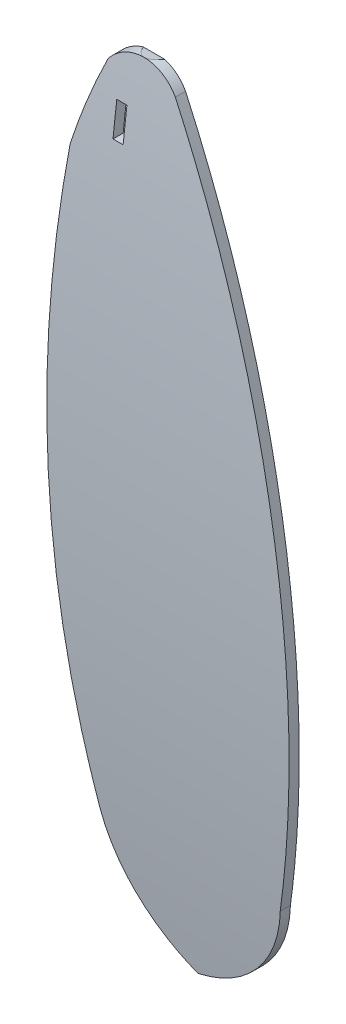
ISO-10303-21;
HEADER;
FILE_DESCRIPTION(('STEP AP214'),'2;1');
FILE_NAME('part.step','',(''),(''),'','','');
FILE_SCHEMA(('AUTOMOTIVE_DESIGN { 1 0 10303 214 1 1 1 1 }'));
ENDSEC;
DATA;
#1=APPLICATION_CONTEXT('core data for automotive mechanical design processes');
#2=APPLICATION_PROTOCOL_DEFINITION('international standard','automotive_design',2000,#1);
#3=PRODUCT_CONTEXT('',#1,'mechanical');
#4=PRODUCT('Part','Part','',(#3));
#5=PRODUCT_RELATED_PRODUCT_CATEGORY('part','',(#4));
#6=PRODUCT_DEFINITION_FORMATION('','',#4);
#7=PRODUCT_DEFINITION_CONTEXT('part definition',#1,'design');
#8=PRODUCT_DEFINITION('design','',#6,#7);
#9=PRODUCT_DEFINITION_SHAPE('','',#8);
#10=(LENGTH_UNIT() NAMED_UNIT(*) SI_UNIT(.MILLI.,.METRE.));
#11=(NAMED_UNIT(*) PLANE_ANGLE_UNIT() SI_UNIT($,.RADIAN.));
#12=(NAMED_UNIT(*) SI_UNIT($,.STERADIAN.) SOLID_ANGLE_UNIT());
#13=UNCERTAINTY_MEASURE_WITH_UNIT(LENGTH_MEASURE(1.E-05),#10,'distance_accuracy_value','');
#14=(GEOMETRIC_REPRESENTATION_CONTEXT(3) GLOBAL_UNCERTAINTY_ASSIGNED_CONTEXT((#13)) GLOBAL_UNIT_ASSIGNED_CONTEXT((#10,
#11,#12)) REPRESENTATION_CONTEXT('',''));
#15=CARTESIAN_POINT('',(0.,0.,0.));
#16=DIRECTION('',(0.,0.,1.));
#17=DIRECTION('',(1.,0.,0.));
#18=AXIS2_PLACEMENT_3D('',#15,#16,#17);
#19=CARTESIAN_POINT('',(-1.524,11.1196353242127,-50.8));
#20=DIRECTION('',(0.,-1.,0.));
#21=DIRECTION('',(0.,0.,-1.));
#22=AXIS2_PLACEMENT_3D('',#19,#20,#21);
#23=PLANE('',#22);
#24=DIRECTION('',(0.,0.,1.));
#25=VECTOR('',#24,1.);
#26=CARTESIAN_POINT('',(-1.524,11.1196353242127,-50.8));
#27=LINE('',#26,#25);
#28=CARTESIAN_POINT('',(-1.524,11.1196353242127,-0.0960141969770789));
#29=VERTEX_POINT('',#28);
#30=CARTESIAN_POINT('',(-1.524,11.1196353242127,1.43734487354896));
#31=VERTEX_POINT('',#30);
#32=EDGE_CURVE('E287',#29,#31,#27,.T.);
#33=ORIENTED_EDGE('',*,*,#32,.T.);
#34=DIRECTION('',(-1.,0.,0.));
#35=VECTOR('',#34,1.);
#36=CARTESIAN_POINT('',(50.8,11.1196353242127,1.43734487354896));
#37=LINE('',#36,#35);
#38=CARTESIAN_POINT('',(0.,11.1196353242127,1.43734487354896));
#39=VERTEX_POINT('',#38);
#40=EDGE_CURVE('E309',#31,#39,#37,.F.);
#41=ORIENTED_EDGE('',*,*,#40,.T.);
#42=DIRECTION('',(0.,0.,1.));
#43=VECTOR('',#42,1.);
#44=CARTESIAN_POINT('',(0.,11.1196353242127,-50.8));
#45=LINE('',#44,#43);
#46=CARTESIAN_POINT('',(0.,11.1196353242127,-0.0960141969770789));
#47=VERTEX_POINT('',#46);
#48=EDGE_CURVE('E279',#47,#39,#45,.T.);
#49=ORIENTED_EDGE('',*,*,#48,.F.);
#50=DIRECTION('',(-1.,0.,0.));
#51=VECTOR('',#50,1.);
#52=CARTESIAN_POINT('',(50.8,11.1196353242127,-0.0960141969770789));
#53=LINE('',#52,#51);
#54=EDGE_CURVE('E298',#47,#29,#53,.T.);
#55=ORIENTED_EDGE('',*,*,#54,.T.);
#56=EDGE_LOOP('',(#33,#41,#49,#55));
#57=FACE_BOUND('',#56,.T.);
#58=ADVANCED_FACE('F34',(#57),#23,.F.);
#59=CARTESIAN_POINT('',(0.,11.1196353242127,-50.8));
#60=DIRECTION('',(1.,0.,0.));
#61=DIRECTION('',(0.,0.,-1.));
#62=AXIS2_PLACEMENT_3D('',#59,#60,#61);
#63=PLANE('',#62);
#64=ORIENTED_EDGE('',*,*,#48,.T.);
#65=CARTESIAN_POINT('',(0.,-34.9373436465168,-414.275316504649));
#66=DIRECTION('',(1.,0.,0.));
#67=DIRECTION('',(0.,0.,-1.));
#68=AXIS2_PLACEMENT_3D('',#65,#66,#67);
#69=CIRCLE('',#68,418.256215903667);
#70=CARTESIAN_POINT('',(0.,15.990702378401,0.868750380737582));
#71=VERTEX_POINT('',#70);
#72=EDGE_CURVE('E281',#39,#71,#69,.F.);
#73=ORIENTED_EDGE('',*,*,#72,.T.);
#74=DIRECTION('',(0.,0.,1.));
#75=VECTOR('',#74,1.);
#76=CARTESIAN_POINT('',(0.,15.990702378401,-50.8));
#77=LINE('',#76,#75);
#78=CARTESIAN_POINT('',(0.,15.990702378401,-0.666716618157315));
#79=VERTEX_POINT('',#78);
#80=EDGE_CURVE('E286',#79,#71,#77,.T.);
#81=ORIENTED_EDGE('',*,*,#80,.F.);
#82=CARTESIAN_POINT('',(0.,-34.9373436465168,-414.275316504649));
#83=DIRECTION('',(1.,0.,0.));
#84=DIRECTION('',(0.,0.,-1.));
#85=AXIS2_PLACEMENT_3D('',#82,#83,#84);
#86=CIRCLE('',#85,416.732215903667);
#87=EDGE_CURVE('E283',#79,#47,#86,.T.);
#88=ORIENTED_EDGE('',*,*,#87,.T.);
#89=EDGE_LOOP('',(#64,#73,#81,#88));
#90=FACE_BOUND('',#89,.T.);
#91=ADVANCED_FACE('F267',(#90),#63,.F.);
#92=CARTESIAN_POINT('',(-1.524,15.990702378401,-50.8));
#93=DIRECTION('',(0.,1.,0.));
#94=DIRECTION('',(0.,0.,1.));
#95=AXIS2_PLACEMENT_3D('',#92,#93,#94);
#96=PLANE('',#95);
#97=ORIENTED_EDGE('',*,*,#80,.T.);
#98=DIRECTION('',(-1.,0.,0.));
#99=VECTOR('',#98,1.);
#100=CARTESIAN_POINT('',(50.8,15.990702378401,0.868750380737582));
#101=LINE('',#100,#99);
#102=CARTESIAN_POINT('',(-1.524,15.990702378401,0.868750380737582));
#103=VERTEX_POINT('',#102);
#104=EDGE_CURVE('E317',#71,#103,#101,.T.);
#105=ORIENTED_EDGE('',*,*,#104,.T.);
#106=DIRECTION('',(0.,0.,1.));
#107=VECTOR('',#106,1.);
#108=CARTESIAN_POINT('',(-1.524,15.990702378401,-50.8));
#109=LINE('',#108,#107);
#110=CARTESIAN_POINT('',(-1.524,15.990702378401,-0.666716618157315));
#111=VERTEX_POINT('',#110);
#112=EDGE_CURVE('E289',#111,#103,#109,.T.);
#113=ORIENTED_EDGE('',*,*,#112,.F.);
#114=DIRECTION('',(-1.,0.,0.));
#115=VECTOR('',#114,1.);
#116=CARTESIAN_POINT('',(50.8,15.990702378401,-0.666716618157315));
#117=LINE('',#116,#115);
#118=EDGE_CURVE('E152',#111,#79,#117,.F.);
#119=ORIENTED_EDGE('',*,*,#118,.T.);
#120=EDGE_LOOP('',(#97,#105,#113,#119));
#121=FACE_BOUND('',#120,.T.);
#122=ADVANCED_FACE('F236',(#121),#96,.F.);
#123=CARTESIAN_POINT('',(-1.524,11.1196353242127,-50.8));
#124=DIRECTION('',(-1.,0.,0.));
#125=DIRECTION('',(0.,0.,1.));
#126=AXIS2_PLACEMENT_3D('',#123,#124,#125);
#127=PLANE('',#126);
#128=ORIENTED_EDGE('',*,*,#112,.T.);
#129=CARTESIAN_POINT('',(-1.524,-34.9373436465168,-414.275316504649));
#130=DIRECTION('',(-1.,0.,0.));
#131=DIRECTION('',(0.,0.,1.));
#132=AXIS2_PLACEMENT_3D('',#129,#130,#131);
#133=CIRCLE('',#132,418.256215903667);
#134=EDGE_CURVE('E313',#103,#31,#133,.F.);
#135=ORIENTED_EDGE('',*,*,#134,.T.);
#136=ORIENTED_EDGE('',*,*,#32,.F.);
#137=CARTESIAN_POINT('',(-1.524,-34.9373436465168,-414.275316504649));
#138=DIRECTION('',(-1.,0.,0.));
#139=DIRECTION('',(0.,0.,1.));
#140=AXIS2_PLACEMENT_3D('',#137,#138,#139);
#141=CIRCLE('',#140,416.732215903667);
#142=EDGE_CURVE('E147',#29,#111,#141,.T.);
#143=ORIENTED_EDGE('',*,*,#142,.T.);
#144=EDGE_LOOP('',(#128,#135,#136,#143));
#145=FACE_BOUND('',#144,.T.);
#146=ADVANCED_FACE('F170',(#145),#127,.F.);
#147=CARTESIAN_POINT('',(50.8,-34.9373436465168,-414.275316504649));
#148=DIRECTION('',(-1.,0.,0.));
#149=DIRECTION('',(0.,0.,1.));
#150=AXIS2_PLACEMENT_3D('',#147,#148,#149);
#151=CYLINDRICAL_SURFACE('',#150,416.732215903667);
#152=CARTESIAN_POINT('',(9.37752582011459,-92.2968781916993,-1.50949479851487));
#153=CARTESIAN_POINT('',(9.08136566680049,-92.1476968419524,-1.48876429566343));
#154=CARTESIAN_POINT('',(8.7884390995515,-91.9922894079436,-1.46725038263321));
#155=CARTESIAN_POINT('',(8.2095097613994,-91.6692894970516,-1.42273660724434));
#156=CARTESIAN_POINT('',(7.92350678535656,-91.5016973817798,-1.399736788986));
#157=CARTESIAN_POINT('',(7.0767029281432,-90.9811297349922,-1.32864136435268));
#158=CARTESIAN_POINT('',(6.52693785093238,-90.6102775950368,-1.27843788382386));
#159=CARTESIAN_POINT('',(5.46132124949474,-89.8239895645493,-1.17320687535343));
#160=CARTESIAN_POINT('',(4.94544812161359,-89.4085825279978,-1.11818247364363));
#161=CARTESIAN_POINT('',(4.1995978333639,-88.7542965495554,-1.03262299138845));
#162=CARTESIAN_POINT('',(3.95563224015144,-88.5309962502855,-1.00359819140788));
#163=CARTESIAN_POINT('',(3.47732647673853,-88.0743110861633,-0.944631099464497));
#164=CARTESIAN_POINT('',(3.24298875209089,-87.8409236896255,-0.914688577724446));
#165=CARTESIAN_POINT('',(2.55498299209608,-87.1261719814676,-0.823630551352297));
#166=CARTESIAN_POINT('',(2.11640188249679,-86.6302879249371,-0.761293741642372));
#167=CARTESIAN_POINT('',(1.28272281862042,-85.6035030394792,-0.634231090506424));
#168=CARTESIAN_POINT('',(0.88762533787941,-85.0726018293162,-0.569505223073846));
#169=CARTESIAN_POINT('',(0.329812671482316,-84.2531117014952,-0.471292178593813));
#170=CARTESIAN_POINT('',(0.149714119917308,-83.9761511909546,-0.438373998669828));
#171=CARTESIAN_POINT('',(-0.198600301554659,-83.4149904576557,-0.372263469846666));
#172=CARTESIAN_POINT('',(-0.366819480845991,-83.1307922814416,-0.339071200205022));
#173=CARTESIAN_POINT('',(-0.853216899637336,-82.2680994030287,-0.239237952106478));
#174=CARTESIAN_POINT('',(-1.15326094586375,-81.6793212736923,-0.1723182951458));
#175=CARTESIAN_POINT('',(-1.77597417017566,-80.3184911241123,-0.020714174560132));
#176=CARTESIAN_POINT('',(-2.08339546724983,-79.5393822416651,0.0639560389427438));
#177=CARTESIAN_POINT('',(-2.48079756414862,-78.3502079595826,0.189666583879325));
#178=CARTESIAN_POINT('',(-2.60260743317367,-77.950561341744,0.231337958195669));
#179=CARTESIAN_POINT('',(-2.82481685076203,-77.1452071631659,0.314119003418244));
#180=CARTESIAN_POINT('',(-2.92521170854676,-76.7394982953234,0.355228549418847));
#181=CARTESIAN_POINT('',(-3.01475435418355,-76.3312811585591,0.395977063195237));
#182=B_SPLINE_CURVE_WITH_KNOTS('',3,(#152,#153,#154,#155,#156,#157,#158,#159,#160,#161,#162,
#163,#164,#165,#166,#167,#168,#169,#170,#171,#172,#173,#174,#175,#176,#177,#178,#179,#180,#181),
.UNSPECIFIED.,.F.,.F.,(4,2,2,2,2,2,2,2,2,2,2,2,2,2,4),(0.,0.996625052460673,1.99322053959339,
3.98584361794098,5.97718396708741,6.97292974911994,7.96892691397729,9.96123875462615,
11.9535722893755,12.9493301607263,13.9448095280834,15.9350956251333,18.455324145974,
19.7144355202253,20.9738224096919),.UNSPECIFIED.);
#183=CARTESIAN_POINT('',(9.37752582011426,-92.2968781916992,-1.50949479851481));
#184=VERTEX_POINT('',#183);
#185=CARTESIAN_POINT('',(-3.01475435418369,-76.3312811585591,0.395977063195219));
#186=VERTEX_POINT('',#185);
#187=EDGE_CURVE('E199',#184,#186,#182,.T.);
#188=ORIENTED_EDGE('',*,*,#187,.T.);
#189=CARTESIAN_POINT('',(-3.01475435418369,-76.3312811585591,0.395977063195219));
#190=CARTESIAN_POINT('',(-3.39224949869839,-74.610270276509,0.56777718575279));
#191=CARTESIAN_POINT('',(-3.75255930226903,-72.8845212428155,0.729222829900547));
#192=CARTESIAN_POINT('',(-4.43854411635565,-69.4243095964039,1.03108226570735));
#193=CARTESIAN_POINT('',(-4.76421887086309,-67.6898469193772,1.17149590190927));
#194=CARTESIAN_POINT('',(-5.68886382951516,-62.4746980792221,1.5606913660331));
#195=CARTESIAN_POINT('',(-6.23548240614732,-58.9821249892658,1.77744037525523));
#196=CARTESIAN_POINT('',(-7.18287167450204,-52.0049118982035,2.12176579844149));
#197=CARTESIAN_POINT('',(-7.58490332017147,-48.5204804195184,2.25012256944059));
#198=CARTESIAN_POINT('',(-8.24865632890356,-41.5361882169028,2.41929141785986));
#199=CARTESIAN_POINT('',(-8.51038067290296,-38.0363278223643,2.46010535525028));
#200=CARTESIAN_POINT('',(-8.89281267838532,-31.0289218317552,2.45330039095284));
#201=CARTESIAN_POINT('',(-9.01351753135393,-27.5213760840184,2.40567972806911));
#202=CARTESIAN_POINT('',(-9.11378214839692,-20.5065726039798,2.22174692351444));
#203=CARTESIAN_POINT('',(-9.09333946372025,-16.9993148777306,2.08543324315654));
#204=CARTESIAN_POINT('',(-8.91092635525993,-9.96124771258592,1.72283347616662));
#205=CARTESIAN_POINT('',(-8.74768073925645,-6.43051126659359,1.49574675832864));
#206=CARTESIAN_POINT('',(-8.39621246071908,-1.14696126542661,1.0884662686079));
#207=CARTESIAN_POINT('',(-8.26128436887329,0.612179504878576,0.941592575178425));
#208=CARTESIAN_POINT('',(-7.9560872621209,4.1254029128455,0.625819211881187));
#209=CARTESIAN_POINT('',(-7.78581842460892,5.87948557585184,0.456919652574919));
#210=CARTESIAN_POINT('',(-7.59797562750495,7.63062834687387,0.277101812202653));
#211=B_SPLINE_CURVE_WITH_KNOTS('',3,(#189,#190,#191,#192,#193,#194,#195,#196,#197,#198,#199,
#200,#201,#202,#203,#204,#205,#206,#207,#208,#209,#210),.UNSPECIFIED.,.F.,.F.,(4,2,2,2,2,2,2,2,
2,2,4),(0.,5.31059490298815,10.6212290570586,21.242108548868,31.7679779337965,42.2936236796566,
52.8194790484772,63.3455170295103,73.9665203972823,79.2773243488992,84.5881016433203),.UNSPECIFIED.);
#212=CARTESIAN_POINT('',(-7.59797562750489,7.63062834687388,0.277101812202751));
#213=VERTEX_POINT('',#212);
#214=EDGE_CURVE('E194',#186,#213,#211,.T.);
#215=ORIENTED_EDGE('',*,*,#214,.T.);
#216=CARTESIAN_POINT('',(-7.59797562750489,7.63062834687388,0.277101812202751));
#217=CARTESIAN_POINT('',(-7.32573778293458,8.70138708731263,0.167159589913933));
#218=CARTESIAN_POINT('',(-7.03245132185526,9.76641596215258,0.0535979523459558));
#219=CARTESIAN_POINT('',(-6.40485285923002,11.8817584277822,-0.180109581122475));
#220=CARTESIAN_POINT('',(-6.07060557231363,12.9320923828444,-0.300244929043531));
#221=CARTESIAN_POINT('',(-5.36130482529112,15.018137898575,-0.546791018195309));
#222=CARTESIAN_POINT('',(-4.98625145694589,16.0538494921188,-0.6732017453142));
#223=CARTESIAN_POINT('',(-4.19538092969777,18.1107199238172,-0.931972265404339));
#224=CARTESIAN_POINT('',(-3.77950099445815,19.1318534953406,-1.06434104497067));
#225=CARTESIAN_POINT('',(-3.34381680704609,20.1441097867132,-1.19932681308748));
#226=B_SPLINE_CURVE_WITH_KNOTS('',3,(#216,#217,#218,#219,#220,#221,#222,#223,#224,#225),
.UNSPECIFIED.,.F.,.F.,(4,2,2,2,4),(0.,3.33061549113126,6.65603513915092,9.98144730943297,
13.3120553162586),.UNSPECIFIED.);
#227=CARTESIAN_POINT('',(-3.3438168070461,20.1441097867132,-1.19932681308749));
#228=VERTEX_POINT('',#227);
#229=EDGE_CURVE('E189',#213,#228,#226,.T.);
#230=ORIENTED_EDGE('',*,*,#229,.T.);
#231=CARTESIAN_POINT('',(-3.3438168070461,20.1441097867132,-1.19932681308749));
#232=CARTESIAN_POINT('',(-3.23404371292992,20.2873015648351,-1.21842038612505));
#233=CARTESIAN_POINT('',(-3.11810453699733,20.4258413759666,-1.23696998949511));
#234=CARTESIAN_POINT('',(-2.87477841874723,20.6926486266148,-1.27282039652602));
#235=CARTESIAN_POINT('',(-2.74739147024114,20.8209160605784,-1.29012119951177));
#236=CARTESIAN_POINT('',(-2.48565042771361,21.06288550455,-1.3228632756649));
#237=CARTESIAN_POINT('',(-2.35157877963548,21.1768880816875,-1.33834224165939));
#238=CARTESIAN_POINT('',(-2.07435054124209,21.3934452813945,-1.3678281612888));
#239=CARTESIAN_POINT('',(-1.93119472385711,21.4960008758922,-1.38183523989123));
#240=CARTESIAN_POINT('',(-1.64321876232727,21.6847071197312,-1.40767207892789));
#241=CARTESIAN_POINT('',(-1.49874642863679,21.771379703613,-1.41957035268673));
#242=CARTESIAN_POINT('',(-1.2032823293786,21.9330251643901,-1.44180578584495));
#243=CARTESIAN_POINT('',(-1.05229059054919,22.0079980892638,-1.45214295164617));
#244=CARTESIAN_POINT('',(-0.740641462720208,22.1475734399677,-1.47141978543125));
#245=CARTESIAN_POINT('',(-0.579833771361957,22.2118466826951,-1.48031492783527));
#246=CARTESIAN_POINT('',(-0.253413228161956,22.3271013882421,-1.49628800861364));
#247=CARTESIAN_POINT('',(-0.0877997562823184,22.3780811273954,-1.50336571133274));
#248=CARTESIAN_POINT('',(0.0796617507557013,22.422190898666,-1.5094947985149));
#249=B_SPLINE_CURVE_WITH_KNOTS('',3,(#231,#232,#233,#234,#235,#236,#237,#238,#239,#240,#241,
#242,#243,#244,#245,#246,#247,#248),.UNSPECIFIED.,.F.,.F.,(4,2,2,2,2,2,2,2,4),(0.,
0.544145805114991,1.08829190439266,1.61768842589258,2.14703996371184,2.65319558001587,
3.15934912060061,3.67897621378686,4.19867064955794),.UNSPECIFIED.);
#250=CARTESIAN_POINT('',(0.0796617507551819,22.4221908986659,-1.50949479851487));
#251=VERTEX_POINT('',#250);
#252=EDGE_CURVE('E139',#228,#251,#249,.T.);
#253=ORIENTED_EDGE('',*,*,#252,.T.);
#254=DIRECTION('',(-1.,0.,0.));
#255=VECTOR('',#254,1.);
#256=CARTESIAN_POINT('',(50.8,22.4221908986659,-1.50949479851487));
#257=LINE('',#256,#255);
#258=CARTESIAN_POINT('',(3.31813864563008,22.4221908986659,-1.50949479851487));
#259=VERTEX_POINT('',#258);
#260=EDGE_CURVE('E126',#259,#251,#257,.T.);
#261=ORIENTED_EDGE('',*,*,#260,.F.);
#262=CARTESIAN_POINT('',(3.31813864562956,22.422190898666,-1.50949479851487));
#263=CARTESIAN_POINT('',(3.49286707943676,22.3761697788358,-1.50310020390491));
#264=CARTESIAN_POINT('',(3.66558272183455,22.3226660831876,-1.49567230012975));
#265=CARTESIAN_POINT('',(4.00573812146923,22.2012019972704,-1.47884088955136));
#266=CARTESIAN_POINT('',(4.17317833854789,22.1332428710597,-1.46943755549095));
#267=CARTESIAN_POINT('',(4.49713204725551,21.985390699276,-1.44902439147303));
#268=CARTESIAN_POINT('',(4.65381847719261,21.905869251613,-1.43806477023988));
#269=CARTESIAN_POINT('',(4.95996904386696,21.7341962560256,-1.41446361211398));
#270=CARTESIAN_POINT('',(5.10943362647949,21.6420454891837,-1.40182217923725));
#271=CARTESIAN_POINT('',(5.39474846058378,21.4494054529684,-1.37546982526557));
#272=CARTESIAN_POINT('',(5.53089784005667,21.349350950122,-1.36181579293468));
#273=CARTESIAN_POINT('',(5.79471812552231,21.138796885201,-1.33316858892903));
#274=CARTESIAN_POINT('',(5.92238891420901,21.0282971786624,-1.31817539873301));
#275=CARTESIAN_POINT('',(6.17174464362002,20.7944852221313,-1.28655480543517));
#276=CARTESIAN_POINT('',(6.29317839967536,20.6709094640091,-1.26989443475012));
#277=CARTESIAN_POINT('',(6.52550182169226,20.4143503769815,-1.23543157259096));
#278=CARTESIAN_POINT('',(6.63639091137455,20.2813665346042,-1.21762901878405));
#279=CARTESIAN_POINT('',(6.74161720343136,20.1441097867132,-1.19932681308744));
#280=B_SPLINE_CURVE_WITH_KNOTS('',3,(#262,#263,#264,#265,#266,#267,#268,#269,#270,#271,#272,
#273,#274,#275,#276,#277,#278,#279),.UNSPECIFIED.,.F.,.F.,(4,2,2,2,2,2,2,2,4),(0.,
0.542230714947677,1.08441403389407,1.6119639670316,2.13948128762199,2.64747742110776,
3.15548058153982,3.67706120244371,4.19867031202195),.UNSPECIFIED.);
#281=CARTESIAN_POINT('',(6.74161720343136,20.1441097867132,-1.19932681308749));
#282=VERTEX_POINT('',#281);
#283=EDGE_CURVE('E136',#259,#282,#280,.T.);
#284=ORIENTED_EDGE('',*,*,#283,.T.);
#285=CARTESIAN_POINT('',(6.74161720343137,20.1441097867132,-1.19932681308749));
#286=CARTESIAN_POINT('',(7.67870794959909,18.7022991429929,-1.00705553288555));
#287=CARTESIAN_POINT('',(8.58664299912147,17.2408447081191,-0.819874500793493));
#288=CARTESIAN_POINT('',(10.3426803361063,14.280979635833,-0.457099725832396));
#289=CARTESIAN_POINT('',(11.1907814210868,12.7825682565141,-0.281506215842126));
#290=CARTESIAN_POINT('',(12.8257260511702,9.75092964261044,0.0567066789284193));
#291=CARTESIAN_POINT('',(13.612559503521,8.21769672530438,0.219323926209268));
#292=CARTESIAN_POINT('',(15.1233614388731,5.11914957856606,0.530229827028914));
#293=CARTESIAN_POINT('',(15.847330349711,3.55383556755743,0.678518578083799));
#294=CARTESIAN_POINT('',(17.231557797926,0.392513227726858,0.959630389457136));
#295=CARTESIAN_POINT('',(17.8917683173781,-1.2035171660481,1.09244180876021));
#296=CARTESIAN_POINT('',(19.1465910246337,-4.42245411849586,1.34131828399159));
#297=CARTESIAN_POINT('',(19.7412030576358,-6.04536074058167,1.45738330040139));
#298=CARTESIAN_POINT('',(20.8636020085046,-9.3151096724213,1.67170524565343));
#299=CARTESIAN_POINT('',(21.3913953111587,-10.9619496784584,1.76996387635216));
#300=CARTESIAN_POINT('',(22.379167904422,-14.2768439504831,1.94774691022462));
#301=CARTESIAN_POINT('',(22.8391472671783,-15.9448981938989,2.02727133332965));
#302=CARTESIAN_POINT('',(23.6910882806882,-19.3021182711166,2.16688459870966));
#303=CARTESIAN_POINT('',(24.0829330296255,-20.9913151611552,2.22694018699412));
#304=CARTESIAN_POINT('',(24.7968525244297,-24.3849836223436,2.3267348278333));
#305=CARTESIAN_POINT('',(25.1189273919373,-26.0894551668574,2.36647391580915));
#306=CARTESIAN_POINT('',(25.6926998399861,-29.5107982962999,2.42507947061599));
#307=CARTESIAN_POINT('',(25.9443879116726,-31.2276715245177,2.443943118311));
#308=CARTESIAN_POINT('',(26.376835199388,-34.670416711297,2.46036911409942));
#309=CARTESIAN_POINT('',(26.5575949905707,-36.3962885967738,2.45793163492626));
#310=CARTESIAN_POINT('',(26.8476024695354,-39.8508081039884,2.43150608401919));
#311=CARTESIAN_POINT('',(26.9569753806769,-41.5794455041105,2.40755592514598));
#312=CARTESIAN_POINT('',(27.1045489266984,-45.0393116873594,2.33803403260947));
#313=CARTESIAN_POINT('',(27.142750017909,-46.7705404537999,2.29246243757811));
#314=CARTESIAN_POINT('',(27.147980758724,-50.2317717650171,2.17974400841313));
#315=CARTESIAN_POINT('',(27.1150360764187,-51.9617745268507,2.11260496285941));
#316=CARTESIAN_POINT('',(26.978195874397,-55.4178330113369,1.9569275567548));
#317=CARTESIAN_POINT('',(26.8743081095342,-57.1438891447099,1.86839153581034));
#318=CARTESIAN_POINT('',(26.6161973901908,-60.3381189293163,1.68467400139383));
#319=CARTESIAN_POINT('',(26.4715098109403,-61.8072361721294,1.59233867580241));
#320=CARTESIAN_POINT('',(26.1309284251713,-64.7381442498872,1.39259077046395));
#321=CARTESIAN_POINT('',(25.9350469830717,-66.1999367671451,1.28518183421452));
#322=CARTESIAN_POINT('',(25.492693269192,-69.1128863088282,1.05576019977551));
#323=CARTESIAN_POINT('',(25.2462818442462,-70.5640539707199,0.933765138790515));
#324=CARTESIAN_POINT('',(24.7031209320181,-73.4560044468644,0.675479845383127));
#325=CARTESIAN_POINT('',(24.4063599390312,-74.8967848088202,0.539186348255948));
#326=CARTESIAN_POINT('',(24.0846787136206,-76.3312811585593,0.395977063195183));
#327=B_SPLINE_CURVE_WITH_KNOTS('',3,(#285,#286,#287,#288,#289,#290,#291,#292,#293,#294,#295,
#296,#297,#298,#299,#300,#301,#302,#303,#304,#305,#306,#307,#308,#309,#310,#311,#312,#313,#314,
#315,#316,#317,#318,#319,#320,#321,#322,#323,#324,#325,#326),.UNSPECIFIED.,.F.,.F.,(4,2,2,2,2,2,
2,2,2,2,2,2,2,2,2,2,2,2,2,2,4),(0.,5.1905446001617,10.3811934848932,15.5726956355928,
20.7641624517653,25.959509080015,31.1548679681483,36.3497300444087,41.5445865938374,
46.7482700964795,51.9519445266467,57.1563216043324,62.3606564791277,67.5558374535211,
72.7509851179935,77.9442587816036,83.1369648545447,87.5733411840294,92.0086470218022,
96.4386430209994,100.869652714016),.UNSPECIFIED.);
#328=CARTESIAN_POINT('',(24.0846787136206,-76.3312811585593,0.395977063195219));
#329=VERTEX_POINT('',#328);
#330=EDGE_CURVE('E146',#282,#329,#327,.T.);
#331=ORIENTED_EDGE('',*,*,#330,.T.);
#332=CARTESIAN_POINT('',(24.0846787136206,-76.3312811585593,0.395977063195219));
#333=CARTESIAN_POINT('',(24.052862697816,-76.5977754051415,0.369375053314512));
#334=CARTESIAN_POINT('',(24.0154000820699,-76.8635461862261,0.34258497614255));
#335=CARTESIAN_POINT('',(23.929252523889,-77.3932205143547,0.288682301090143));
#336=CARTESIAN_POINT('',(23.8805679576779,-77.6571241236913,0.26156971405096));
#337=CARTESIAN_POINT('',(23.7178117234839,-78.4452956208079,0.179839896195566));
#338=CARTESIAN_POINT('',(23.5870211129764,-78.966161415195,0.124816897282306));
#339=CARTESIAN_POINT('',(23.2819171926531,-79.9945278806894,0.014264845051882));
#340=CARTESIAN_POINT('',(23.1076344682832,-80.5020376681945,-0.0412638263258226));
#341=CARTESIAN_POINT('',(22.8145433524623,-81.2507398679986,-0.124532029383769));
#342=CARTESIAN_POINT('',(22.7115634987603,-81.498223624306,-0.152285125051396));
#343=CARTESIAN_POINT('',(22.4951915451227,-81.9886786403464,-0.207722305792591));
#344=CARTESIAN_POINT('',(22.3817968153083,-82.2316487416041,-0.235406371612615));
#345=CARTESIAN_POINT('',(22.026261487931,-82.9531407372537,-0.31824481788235));
#346=CARTESIAN_POINT('',(21.7687732035808,-83.4242355098761,-0.373184465140745));
#347=CARTESIAN_POINT('',(21.2147968782532,-84.3429848013009,-0.481845639782866));
#348=CARTESIAN_POINT('',(20.9183080788264,-84.7906388640111,-0.535567143453326));
#349=CARTESIAN_POINT('',(20.2883425865906,-85.6594202055463,-0.641175970874163));
#350=CARTESIAN_POINT('',(19.9548632884301,-86.0805456125991,-0.693063165088787));
#351=CARTESIAN_POINT('',(19.2532715159155,-86.8931853256712,-0.794364105155273));
#352=CARTESIAN_POINT('',(18.8851601010045,-87.2847005368457,-0.843777926600133));
#353=CARTESIAN_POINT('',(18.1171838359462,-88.035004543566,-0.939471043055667));
#354=CARTESIAN_POINT('',(17.7173439110522,-88.3938185615651,-0.985752746654757));
#355=CARTESIAN_POINT('',(16.8884005188961,-89.0764838580723,-1.07462460714602));
#356=CARTESIAN_POINT('',(16.4592979407223,-89.4003361980507,-1.11721487610599));
#357=CARTESIAN_POINT('',(15.7962825598197,-89.8579022732422,-1.17787562163004));
#358=CARTESIAN_POINT('',(15.5721084318819,-90.0056891128474,-1.19755395223418));
#359=CARTESIAN_POINT('',(15.1176842003861,-90.2916304407626,-1.23577420709818));
#360=CARTESIAN_POINT('',(14.8874356120669,-90.4297873004775,-1.25431641099486));
#361=CARTESIAN_POINT('',(14.1882419972223,-90.8293857974921,-1.30813659594373));
#362=CARTESIAN_POINT('',(13.7106225349713,-91.076111704679,-1.34162894058385));
#363=CARTESIAN_POINT('',(12.7956624123688,-91.5005639722491,-1.3995698604258));
#364=CARTESIAN_POINT('',(12.3605461772203,-91.6830393732348,-1.42462360738119));
#365=CARTESIAN_POINT('',(11.4785708181138,-92.0148711428196,-1.47037116895621));
#366=CARTESIAN_POINT('',(11.0317351126938,-92.1642886549315,-1.49107302918119));
#367=CARTESIAN_POINT('',(10.5798056564902,-92.2968781916993,-1.50949479851487));
#368=B_SPLINE_CURVE_WITH_KNOTS('',3,(#332,#333,#334,#335,#336,#337,#338,#339,#340,#341,#342,
#343,#344,#345,#346,#347,#348,#349,#350,#351,#352,#353,#354,#355,#356,#357,#358,#359,#360,#361,
#362,#363,#364,#365,#366,#367),.UNSPECIFIED.,.F.,.F.,(4,2,2,2,2,2,2,2,2,2,2,2,2,2,2,2,2,4),(0.,
0.808985380204548,1.61794364255306,3.23544484246326,4.85181173870159,5.66006290059924,
6.46851871950581,8.08545881390663,9.70243035785998,11.3195158623632,12.936551914121,
14.5523299984318,16.1680590123469,16.9755236383389,17.7827887166377,19.3964933159059,
20.8127021522275,22.2262692697474),.UNSPECIFIED.);
#369=CARTESIAN_POINT('',(10.5798056564908,-92.2968781916992,-1.50949479851481));
#370=VERTEX_POINT('',#369);
#371=EDGE_CURVE('E149',#329,#370,#368,.T.);
#372=ORIENTED_EDGE('',*,*,#371,.T.);
#373=DIRECTION('',(-1.,0.,0.));
#374=VECTOR('',#373,1.);
#375=CARTESIAN_POINT('',(50.8,-92.2968781916992,-1.50949479851481));
#376=LINE('',#375,#374);
#377=EDGE_CURVE('E140',#370,#184,#376,.T.);
#378=ORIENTED_EDGE('',*,*,#377,.T.);
#379=EDGE_LOOP('',(#188,#215,#230,#253,#261,#284,#331,#372,#378));
#380=FACE_BOUND('',#379,.T.);
#381=ORIENTED_EDGE('',*,*,#54,.F.);
#382=ORIENTED_EDGE('',*,*,#87,.F.);
#383=ORIENTED_EDGE('',*,*,#118,.F.);
#384=ORIENTED_EDGE('',*,*,#142,.F.);
#385=EDGE_LOOP('',(#381,#382,#383,#384));
#386=FACE_BOUND('',#385,.T.);
#387=ADVANCED_FACE('F134',(#380,#386),#151,.F.);
#388=CARTESIAN_POINT('',(50.8,22.4221908986659,-1.50949479851487));
#389=DIRECTION('',(0.,-0.99048215125646,0.137641229442256));
#390=DIRECTION('',(0.,-0.137641229442256,-0.99048215125646));
#391=AXIS2_PLACEMENT_3D('',#388,#389,#390);
#392=PLANE('',#391);
#393=CARTESIAN_POINT('',(1.69890019819263,16.2773887994329,-45.7281989393907));
#394=DIRECTION('',(0.,-0.99048215125646,0.137641229442256));
#395=DIRECTION('',(0.,0.137641229442256,0.99048215125646));
#396=AXIS2_PLACEMENT_3D('',#393,#394,#395);
#397=ELLIPSE('',#396,46.1676153188454,6.354567332903);
#398=CARTESIAN_POINT('',(1.69890019819263,22.6319561323359,0.));
#399=VERTEX_POINT('',#398);
#400=EDGE_CURVE('E43',#399,#259,#397,.F.);
#401=ORIENTED_EDGE('',*,*,#400,.T.);
#402=ORIENTED_EDGE('',*,*,#260,.T.);
#403=EDGE_CURVE('E128',#251,#399,#397,.F.);
#404=ORIENTED_EDGE('',*,*,#403,.T.);
#405=EDGE_LOOP('',(#401,#402,#404));
#406=FACE_BOUND('',#405,.T.);
#407=ADVANCED_FACE('F125',(#406),#392,.F.);
#408=CARTESIAN_POINT('',(50.8,-92.2968781916993,-1.50949479851487));
#409=DIRECTION('',(0.,0.990482151256451,0.137641229442318));
#410=DIRECTION('',(0.,-0.137641229442318,0.990482151256451));
#411=AXIS2_PLACEMENT_3D('',#408,#409,#410);
#412=PLANE('',#411);
#413=CARTESIAN_POINT('',(5.2343233043722,-74.0807724959517,-132.594690928648));
#414=DIRECTION('',(0.,0.990482151256451,0.137641229442318));
#415=DIRECTION('',(0.,-0.137641229442318,0.990482151256451));
#416=AXIS2_PLACEMENT_3D('',#413,#414,#415);
#417=ELLIPSE('',#416,137.925403348648,18.9842220882356);
#418=CARTESIAN_POINT('',(9.80465904563834,-92.5066434253694,0.));
#419=VERTEX_POINT('',#418);
#420=EDGE_CURVE('E49',#370,#419,#417,.F.);
#421=ORIENTED_EDGE('',*,*,#420,.T.);
#422=CARTESIAN_POINT('',(19.957926377032,-71.2923560536931,-152.660457033161));
#423=DIRECTION('',(0.,0.990482151256451,0.137641229442318));
#424=DIRECTION('',(0.,-0.137641229442318,0.990482151256451));
#425=AXIS2_PLACEMENT_3D('',#422,#423,#424);
#426=ELLIPSE('',#425,170.870448117957,23.5188185543154);
#427=EDGE_CURVE('E12',#419,#184,#426,.F.);
#428=ORIENTED_EDGE('',*,*,#427,.T.);
#429=ORIENTED_EDGE('',*,*,#377,.F.);
#430=EDGE_LOOP('',(#421,#428,#429));
#431=FACE_BOUND('',#430,.T.);
#432=ADVANCED_FACE('F171',(#431),#412,.F.);
#433=CARTESIAN_POINT('',(50.8,-34.9373436465168,-414.275316504649));
#434=DIRECTION('',(-1.,0.,0.));
#435=DIRECTION('',(0.,0.,1.));
#436=AXIS2_PLACEMENT_3D('',#433,#434,#435);
#437=CYLINDRICAL_SURFACE('',#436,418.256215903667);
#438=CARTESIAN_POINT('',(24.0846787136206,-76.3312811585593,1.9275235617105));
#439=CARTESIAN_POINT('',(24.4571673721079,-74.6702580069424,2.0927458552644));
#440=CARTESIAN_POINT('',(24.7962307329193,-73.0008069884728,2.24871878349487));
#441=CARTESIAN_POINT('',(25.4068236501572,-69.6479105587089,2.54150829306814));
#442=CARTESIAN_POINT('',(25.678352241987,-67.9644649478853,2.6783246007854));
#443=CARTESIAN_POINT('',(26.1531918484304,-64.5864163234846,2.93214390298034));
#444=CARTESIAN_POINT('',(26.3564999560508,-62.8918128375876,3.04914605303717));
#445=CARTESIAN_POINT('',(26.6943643851575,-59.4944984566659,3.26283113947378));
#446=CARTESIAN_POINT('',(26.8289211301013,-57.7917876116417,3.35951420100195));
#447=CARTESIAN_POINT('',(27.028819441548,-54.382680810308,3.53211715422949));
#448=CARTESIAN_POINT('',(27.0942184826701,-52.6762890968483,3.60805424820663));
#449=CARTESIAN_POINT('',(27.1557708930281,-49.2614470965352,3.73903941928896));
#450=CARTESIAN_POINT('',(27.1519239538342,-47.5529968005466,3.79408740335042));
#451=CARTESIAN_POINT('',(27.0749109285644,-44.1372330586864,3.88319748460612));
#452=CARTESIAN_POINT('',(27.0017497917603,-42.4299195403551,3.91726107987119));
#453=CARTESIAN_POINT('',(26.7861963559838,-39.0193803495294,3.96445638004286));
#454=CARTESIAN_POINT('',(26.6438041241493,-37.3161546730723,3.9775881052484));
#455=CARTESIAN_POINT('',(26.2898562300435,-33.9152304244974,3.98311051338176));
#456=CARTESIAN_POINT('',(26.0782347598319,-32.2175386697169,3.97548141078096));
#457=CARTESIAN_POINT('',(25.5862561640135,-28.8323603109209,3.93976753773267));
#458=CARTESIAN_POINT('',(25.3058989522023,-27.144873719707,3.91168274163073));
#459=CARTESIAN_POINT('',(24.6769529667642,-23.7829178941008,3.83551619196406));
#460=CARTESIAN_POINT('',(24.3283562466121,-22.1084501993998,3.78743210873809));
#461=CARTESIAN_POINT('',(23.5636386988482,-18.7756965604894,3.67186133488234));
#462=CARTESIAN_POINT('',(23.1475183342124,-17.1174105054131,3.60437477728321));
#463=CARTESIAN_POINT('',(22.2490385611547,-13.8216108070336,3.45079789318171));
#464=CARTESIAN_POINT('',(21.7667483957258,-12.18407737873,3.364726960864));
#465=CARTESIAN_POINT('',(20.7365449623353,-8.93084044227077,3.17477495495681));
#466=CARTESIAN_POINT('',(20.1886318987333,-7.31513686615104,3.07089393683021));
#467=CARTESIAN_POINT('',(19.0284259842159,-4.10878841303495,2.8463016659801));
#468=CARTESIAN_POINT('',(18.4161535743545,-2.51813576310829,2.72559575303327));
#469=CARTESIAN_POINT('',(17.1283065874886,0.635861545475959,2.46838461302907));
#470=CARTESIAN_POINT('',(16.452738057358,2.19920879580776,2.33188089489238));
#471=CARTESIAN_POINT('',(15.0969156912644,5.17041115054049,2.05588807479315));
#472=CARTESIAN_POINT('',(14.421498485572,6.58058277835073,1.91754182467402));
#473=CARTESIAN_POINT('',(13.0194543387232,9.37363980118011,1.62944371710291));
#474=CARTESIAN_POINT('',(12.2928393166255,10.7565314517619,1.4796945136537));
#475=CARTESIAN_POINT('',(10.7905984161717,13.4912596347712,1.1700139342979));
#476=CARTESIAN_POINT('',(10.0150554744181,14.8431436898414,1.01009978545864));
#477=CARTESIAN_POINT('',(8.41485674596537,17.5167591088014,0.680880928597562));
#478=CARTESIAN_POINT('',(7.59019038124425,18.8384838929619,0.511574198561573));
#479=CARTESIAN_POINT('',(6.74161720343139,20.1441097867132,0.338112643198826));
#480=B_SPLINE_CURVE_WITH_KNOTS('',3,(#438,#439,#440,#441,#442,#443,#444,#445,#446,#447,#448,
#449,#450,#451,#452,#453,#454,#455,#456,#457,#458,#459,#460,#461,#462,#463,#464,#465,#466,#467,
#468,#469,#470,#471,#472,#473,#474,#475,#476,#477,#478,#479),.UNSPECIFIED.,.F.,.F.,(4,2,2,2,2,2,
2,2,2,2,2,2,2,2,2,2,2,2,2,2,4),(0.,5.13047441177186,10.261022097722,15.3917883774587,
20.5225230550894,25.6489903942236,30.7754805672712,35.9016047189056,41.0277238994117,
46.1587300954679,51.2897427265724,56.4213532225147,61.552928535045,66.6791743267263,
71.8054041549155,76.9300107420975,82.0541282579947,86.7620839977566,91.4689473048039,
96.1680360034258,100.868140266959),.UNSPECIFIED.);
#481=CARTESIAN_POINT('',(24.0846787136206,-76.3312811585593,1.9275235617105));
#482=VERTEX_POINT('',#481);
#483=CARTESIAN_POINT('',(6.74161720343136,20.1441097867132,0.338112643198829));
#484=VERTEX_POINT('',#483);
#485=EDGE_CURVE('E252',#482,#484,#480,.T.);
#486=ORIENTED_EDGE('',*,*,#485,.T.);
#487=CARTESIAN_POINT('',(6.74161720343136,20.1441097867132,0.338112643198829));
#488=CARTESIAN_POINT('',(6.63331018936872,20.2853871471725,0.319344187391411));
#489=CARTESIAN_POINT('',(6.51900399680666,20.4221348669164,0.301103478205807));
#490=CARTESIAN_POINT('',(6.27923771329482,20.6856426186122,0.265831219226633));
#491=CARTESIAN_POINT('',(6.15377764690637,20.8124026725563,0.248799666770594));
#492=CARTESIAN_POINT('',(5.89259336002192,21.0549648099187,0.216105032816617));
#493=CARTESIAN_POINT('',(5.75687275169408,21.170770717661,0.200441473870787));
#494=CARTESIAN_POINT('',(5.47607603838614,21.3906323664827,0.17061913385791));
#495=CARTESIAN_POINT('',(5.33100015925764,21.4946883910569,0.156460316485766));
#496=CARTESIAN_POINT('',(5.03242419625618,21.6903378795522,0.129772249785029));
#497=CARTESIAN_POINT('',(4.87891980048966,21.7819248795701,0.11724384580497));
#498=CARTESIAN_POINT('',(4.56457927621809,21.9519238535315,0.0939400200615454));
#499=CARTESIAN_POINT('',(4.40374045659984,22.0303309413019,0.0831652484670398));
#500=CARTESIAN_POINT('',(4.07604150439562,22.1732906923171,0.0634854369908339));
#501=CARTESIAN_POINT('',(3.90918562309499,22.237852921825,0.054579106181571));
#502=CARTESIAN_POINT('',(3.57047872359049,22.3527250512908,0.0387111807544473));
#503=CARTESIAN_POINT('',(3.39862590080964,22.4030297300382,0.0317502985858411));
#504=CARTESIAN_POINT('',(3.05232665809525,22.4886991580719,0.0198845415385673));
#505=CARTESIAN_POINT('',(2.87790364397196,22.5241567682577,0.0149668888378301));
#506=CARTESIAN_POINT('',(2.52665039191769,22.5803237666909,0.00717272585709011));
#507=CARTESIAN_POINT('',(2.34982011496309,22.6010329155635,0.00429624870640508));
#508=CARTESIAN_POINT('',(1.99500226792613,22.6275465324389,0.000612968255051608));
#509=CARTESIAN_POINT('',(1.81701455771973,22.6333491607984,-0.000193579591491075));
#510=CARTESIAN_POINT('',(1.46118272935201,22.6300003110134,0.000271787269712165));
#511=CARTESIAN_POINT('',(1.28333861088845,22.6208488644269,0.00154369759124774));
#512=CARTESIAN_POINT('',(0.929969718474577,22.5877456805028,0.00614158437237948));
#513=CARTESIAN_POINT('',(0.754437760106233,22.5638691239045,0.00945712678681439));
#514=CARTESIAN_POINT('',(0.406030383432444,22.5015618689284,0.0181003665719648));
#515=CARTESIAN_POINT('',(0.233154911059463,22.4631314671748,0.0234280229334674));
#516=CARTESIAN_POINT('',(-0.10876980011885,22.3719904397839,0.0360452551313587));
#517=CARTESIAN_POINT('',(-0.27781791534189,22.3192756781627,0.0433353991948382));
#518=CARTESIAN_POINT('',(-0.610785832535476,22.1999845033119,0.0598032895691894));
#519=CARTESIAN_POINT('',(-0.774707461367343,22.1334130942638,0.0689803544240708));
#520=CARTESIAN_POINT('',(-1.09673225560133,21.9867098417015,0.0891604579911479));
#521=CARTESIAN_POINT('',(-1.25482029247558,21.9065453959697,0.100167885478774));
#522=CARTESIAN_POINT('',(-1.56359822711277,21.7333901334901,0.123884392902616));
#523=CARTESIAN_POINT('',(-1.7142907807765,21.6404039677241,0.136592855752398));
#524=CARTESIAN_POINT('',(-2.00721426456581,21.4423171146121,0.163588493329336));
#525=CARTESIAN_POINT('',(-2.1494499379394,21.3372233171818,0.17787477000309));
#526=CARTESIAN_POINT('',(-2.42453220325426,21.1156746653732,0.207896388339869));
#527=CARTESIAN_POINT('',(-2.55738221051312,20.9992239807154,0.223631198050929));
#528=CARTESIAN_POINT('',(-2.80435497255398,20.7638511743973,0.255324307111935));
#529=CARTESIAN_POINT('',(-2.91913549660481,20.6456067493052,0.271198371099979));
#530=CARTESIAN_POINT('',(-3.1389030335269,20.4008852868546,0.303937453629919));
#531=CARTESIAN_POINT('',(-3.24390845052956,20.2744245140372,0.320800508353288));
#532=CARTESIAN_POINT('',(-3.34381680704609,20.1441097867132,0.338112643198859));
#533=B_SPLINE_CURVE_WITH_KNOTS('',3,(#487,#488,#489,#490,#491,#492,#493,#494,#495,#496,#497,
#498,#499,#500,#501,#502,#503,#504,#505,#506,#507,#508,#509,#510,#511,#512,#513,#514,#515,#516,
#517,#518,#519,#520,#521,#522,#523,#524,#525,#526,#527,#528,#529,#530,#531,#532),.UNSPECIFIED.,
.F.,.F.,(4,2,2,2,2,2,2,2,2,2,2,2,2,2,2,2,2,2,2,2,2,2,4),(0.,0.536850874178348,1.07370056621563,
1.61036213551222,2.14701075376355,2.68393651821077,3.22106089958048,3.75781294427306,
4.29476129792911,4.8282992501624,5.36184586179003,5.89545831630913,6.42906964473702,
6.9599788590473,7.49087725339669,8.02192953198571,8.55279035838645,9.0849429195477,
9.61690295173651,10.1485617505474,10.6800260786415,11.176196234955,11.671412486334),.UNSPECIFIED.);
#534=EDGE_CURVE('E318',#484,#399,#533,.T.);
#535=ORIENTED_EDGE('',*,*,#534,.T.);
#536=CARTESIAN_POINT('',(-3.3438168070461,20.1441097867132,0.338112643198829));
#537=VERTEX_POINT('',#536);
#538=EDGE_CURVE('E57',#399,#537,#533,.T.);
#539=ORIENTED_EDGE('',*,*,#538,.T.);
#540=CARTESIAN_POINT('',(-3.34381680704608,20.1441097867132,0.338112643198829));
#541=CARTESIAN_POINT('',(-3.77950499329501,19.1318442197559,0.472599100358718));
#542=CARTESIAN_POINT('',(-4.19538759182516,18.110703440986,0.604478414809713));
#543=CARTESIAN_POINT('',(-4.98626129839558,16.0538230545748,0.862292350942475));
#544=CARTESIAN_POINT('',(-5.36131518210505,15.0181087048233,0.988235924989236));
#545=CARTESIAN_POINT('',(-6.07061525153956,12.932062650807,1.23387110873239));
#546=CARTESIAN_POINT('',(-6.40486134616805,11.8817309139171,1.35356270447195));
#547=CARTESIAN_POINT('',(-7.03245627126307,9.76639818619544,1.58640715284835));
#548=CARTESIAN_POINT('',(-7.32574038956306,8.70137684052622,1.6995494974457));
#549=CARTESIAN_POINT('',(-7.59797562750489,7.63062834687388,1.80908587355167));
#550=B_SPLINE_CURVE_WITH_KNOTS('',3,(#540,#541,#542,#543,#544,#545,#546,#547,#548,#549),
.UNSPECIFIED.,.F.,.F.,(4,2,2,2,4),(0.,3.3304562531381,6.65571724384527,9.98098565750605,
13.3114493401122),.UNSPECIFIED.);
#551=CARTESIAN_POINT('',(-7.59797562750489,7.63062834687388,1.80908587355166));
#552=VERTEX_POINT('',#551);
#553=EDGE_CURVE('E222',#537,#552,#550,.T.);
#554=ORIENTED_EDGE('',*,*,#553,.T.);
#555=CARTESIAN_POINT('',(-7.59797562750492,7.63062834687386,1.80908587355166));
#556=CARTESIAN_POINT('',(-7.78582153424074,5.87945646233871,1.98824462160906));
#557=CARTESIAN_POINT('',(-7.95609206647204,4.1253526203511,2.15652496007948));
#558=CARTESIAN_POINT('',(-8.26129073129425,0.612101252639633,2.47114045109707));
#559=CARTESIAN_POINT('',(-8.39621868772639,-1.14704629817951,2.61747549426028));
#560=CARTESIAN_POINT('',(-8.74768533474759,-6.43059749711198,3.02326221732462));
#561=CARTESIAN_POINT('',(-8.91092822282007,-9.96130915735145,3.24951592132934));
#562=CARTESIAN_POINT('',(-9.0933402850855,-16.9993570871533,3.6107896679909));
#563=CARTESIAN_POINT('',(-9.11378206875632,-20.5066208098936,3.74660579723098));
#564=CARTESIAN_POINT('',(-9.01351629971367,-27.5214196214357,3.92986706193385));
#565=CARTESIAN_POINT('',(-8.89281117987367,-31.0289547045182,3.97731372053727));
#566=CARTESIAN_POINT('',(-8.51037974932077,-38.0363393303453,3.9840935007726));
#567=CARTESIAN_POINT('',(-8.24865622668448,-41.5361890236642,3.94342836441588));
#568=CARTESIAN_POINT('',(-7.58490387672613,-48.5204748320654,3.77487646284031));
#569=CARTESIAN_POINT('',(-7.18287208818997,-52.0049106202645,3.6469878567107));
#570=CARTESIAN_POINT('',(-6.23548573494909,-58.9820986892278,3.30392102350834));
#571=CARTESIAN_POINT('',(-5.68887274588724,-62.4746431455643,3.08796687187752));
#572=CARTESIAN_POINT('',(-4.76423040366907,-67.6897841951165,2.70019870471418));
#573=CARTESIAN_POINT('',(-4.43855553572356,-69.424250248215,2.56030000294092));
#574=CARTESIAN_POINT('',(-3.75256751052435,-72.8844815861495,2.25954748224106));
#575=CARTESIAN_POINT('',(-3.39225460748988,-74.6102469347449,2.09869381710634));
#576=CARTESIAN_POINT('',(-3.0147543541836,-76.3312811585591,1.92752356171055));
#577=B_SPLINE_CURVE_WITH_KNOTS('',3,(#555,#556,#557,#558,#559,#560,#561,#562,#563,#564,#565,
#566,#567,#568,#569,#570,#571,#572,#573,#574,#575,#576),.UNSPECIFIED.,.F.,.F.,(4,2,2,2,2,2,2,2,
2,2,4),(0.,5.3106647005722,10.6213558707042,21.2421338767537,31.7681398880757,42.2939644709507,
52.8195809552514,63.3454195967336,73.9660746278034,79.2765972416,84.5870808828073),.UNSPECIFIED.);
#578=CARTESIAN_POINT('',(-3.01475435418369,-76.3312811585591,1.9275235617105));
#579=VERTEX_POINT('',#578);
#580=EDGE_CURVE('E215',#552,#579,#577,.T.);
#581=ORIENTED_EDGE('',*,*,#580,.T.);
#582=CARTESIAN_POINT('',(-3.01475435418356,-76.3312811585591,1.9275235617105));
#583=CARTESIAN_POINT('',(-2.94356414152848,-76.6558417358147,1.89524454661783));
#584=CARTESIAN_POINT('',(-2.86550725283046,-76.978835023901,1.86273683632263));
#585=CARTESIAN_POINT('',(-2.69579645181821,-77.621181706851,1.79734092412894));
#586=CARTESIAN_POINT('',(-2.60414288395935,-77.9405351937041,1.76445273188897));
#587=CARTESIAN_POINT('',(-2.30903355506798,-78.8922482748526,1.66534637014789));
#588=CARTESIAN_POINT('',(-2.0853944157558,-79.5184188106844,1.59867064390469));
#589=CARTESIAN_POINT('',(-1.58602103965836,-80.7493177792618,1.46487684579164));
#590=CARTESIAN_POINT('',(-1.31030541072515,-81.3540537795599,1.39775894016254));
#591=CARTESIAN_POINT('',(-0.859200661297182,-82.2418913211876,1.29733752958501));
#592=CARTESIAN_POINT('',(-0.7025714008484,-82.5346354423795,1.26390520073041));
#593=CARTESIAN_POINT('',(-0.377014268404537,-83.1133230377683,1.19721206450223));
#594=CARTESIAN_POINT('',(-0.208083255180473,-83.3992647500798,1.16395130327626));
#595=CARTESIAN_POINT('',(0.316877663637308,-84.2463278464974,1.06455560715749));
#596=CARTESIAN_POINT('',(0.690953266971523,-84.7964467660334,0.998834525384524));
#597=CARTESIAN_POINT('',(1.48448480091795,-85.8631723595227,0.869370211531243));
#598=CARTESIAN_POINT('',(1.90394098932194,-86.3797788430766,0.805626990689139));
#599=CARTESIAN_POINT('',(2.56469054825628,-87.1265163269261,0.712171686998651));
#600=CARTESIAN_POINT('',(2.79014245389106,-87.3706773356677,0.681387084814944));
#601=CARTESIAN_POINT('',(3.25116686672102,-87.8492092301913,0.620640056106819));
#602=CARTESIAN_POINT('',(3.48673644875893,-88.0835829074861,0.590677395998722));
#603=CARTESIAN_POINT('',(4.20808951047142,-88.7714482158102,0.502172020430263));
#604=CARTESIAN_POINT('',(4.70865558804575,-89.209840384647,0.444992288632453));
#605=CARTESIAN_POINT('',(5.57890450474256,-89.9090867300169,0.352771158218294));
#606=CARTESIAN_POINT('',(5.93906069247526,-90.1817793164543,0.316512254954194));
#607=CARTESIAN_POINT('',(6.67462305390775,-90.7060772082699,0.246311884626149));
#608=CARTESIAN_POINT('',(7.0500277786338,-90.9576845103244,0.212370198189328));
#609=CARTESIAN_POINT('',(7.81461472932146,-91.4387867905124,0.147062295293827));
#610=CARTESIAN_POINT('',(8.2037879317414,-91.668295897202,0.115694435172652));
#611=CARTESIAN_POINT('',(8.99494960787174,-92.1046667336591,0.0557197119837584));
#612=CARTESIAN_POINT('',(9.39694091524802,-92.3115234102617,0.0271134651276195));
#613=CARTESIAN_POINT('',(9.80465904563833,-92.5066434253694,0.));
#614=B_SPLINE_CURVE_WITH_KNOTS('',3,(#582,#583,#584,#585,#586,#587,#588,#589,#590,#591,#592,
#593,#594,#595,#596,#597,#598,#599,#600,#601,#602,#603,#604,#605,#606,#607,#608,#609,#610,#611,
#612,#613),.UNSPECIFIED.,.F.,.F.,(4,2,2,2,2,2,2,2,2,2,2,2,2,2,2,4),(0.,1.00137311252973,
2.00272086081749,4.00492937693689,6.00642381731309,7.00723714875999,8.00830693818794,
10.0112570682855,12.0142185770638,13.0152112211322,14.0159163875002,16.0166999368205,
17.3756382459217,18.7344477242701,20.0923825926688,21.4506197664045),.UNSPECIFIED.);
#615=EDGE_CURVE('E221',#579,#419,#614,.T.);
#616=ORIENTED_EDGE('',*,*,#615,.T.);
#617=CARTESIAN_POINT('',(9.80465904563831,-92.5066434253694,0.));
#618=CARTESIAN_POINT('',(10.0633610190167,-92.4424756798851,0.00891667747004404));
#619=CARTESIAN_POINT('',(10.3206577330512,-92.3728713738539,0.0185743178969641));
#620=CARTESIAN_POINT('',(10.8320330804588,-92.2229151033884,0.0393359368626902));
#621=CARTESIAN_POINT('',(11.0861118034719,-92.1425634390555,0.0504398750159148));
#622=CARTESIAN_POINT('',(11.8427790225018,-91.8856214470655,0.0858614418311629));
#623=CARTESIAN_POINT('',(12.3399551457586,-91.6931052521026,0.112294245840527));
#624=CARTESIAN_POINT('',(13.3155916889443,-91.2673020056686,0.170390432106295));
#625=CARTESIAN_POINT('',(13.7940710127297,-91.0340575111914,0.202048352765751));
#626=CARTESIAN_POINT('',(14.495519772794,-90.6548977049171,0.253129480131182));
#627=CARTESIAN_POINT('',(14.7266349230419,-90.5236219876226,0.270756487155046));
#628=CARTESIAN_POINT('',(15.1831424971257,-90.2514966502561,0.307154756940922));
#629=CARTESIAN_POINT('',(15.4085334839538,-90.1106446581358,0.325926303086179));
#630=CARTESIAN_POINT('',(16.0754402157762,-89.6741388736011,0.383858688982295));
#631=CARTESIAN_POINT('',(16.5077713752773,-89.3644911228365,0.42464324415504));
#632=CARTESIAN_POINT('',(17.3446760957479,-88.7102718574511,0.50998111374657));
#633=CARTESIAN_POINT('',(17.7492488902517,-88.3656993791366,0.554534532155668));
#634=CARTESIAN_POINT('',(18.5279346937873,-87.6440443404086,0.646842619146054));
#635=CARTESIAN_POINT('',(18.902046518317,-87.2669605169351,0.694597412084122));
#636=CARTESIAN_POINT('',(19.6172122577575,-86.4829785281289,0.792708857104725));
#637=CARTESIAN_POINT('',(19.9582667211849,-86.0760808576902,0.843065465994403));
#638=CARTESIAN_POINT('',(20.6071045782616,-85.2326006404547,0.946107505002261));
#639=CARTESIAN_POINT('',(20.9146570075403,-84.7958421439401,0.998805957891722));
#640=CARTESIAN_POINT('',(21.4918346563318,-83.8980384778681,1.10561314414897));
#641=CARTESIAN_POINT('',(21.7614603881456,-83.4369936364781,1.15972185845572));
#642=CARTESIAN_POINT('',(22.1359506551236,-82.729869598231,1.24146174208945));
#643=CARTESIAN_POINT('',(22.2557871087585,-82.4915740620407,1.26880391329269));
#644=CARTESIAN_POINT('',(22.4852840838784,-82.0102177558695,1.32360711824449));
#645=CARTESIAN_POINT('',(22.5949472497123,-81.7671582442009,1.35106811915218));
#646=CARTESIAN_POINT('',(22.908377070654,-81.0314989111759,1.43351710799335));
#647=CARTESIAN_POINT('',(23.096677462632,-80.532241829381,1.48859151617758));
#648=CARTESIAN_POINT('',(23.461659506958,-79.4253518940345,1.60861402297925));
#649=CARTESIAN_POINT('',(23.6296741552348,-78.8148253772194,1.67349438102336));
#650=CARTESIAN_POINT('',(23.8352501091714,-77.8894454190411,1.7697235518408));
#651=CARTESIAN_POINT('',(23.8960061871583,-77.5796233140329,1.80159452339738));
#652=CARTESIAN_POINT('',(24.0020046726262,-76.957299701699,1.86490423680263));
#653=CARTESIAN_POINT('',(24.0472474141529,-76.6447982522156,1.89634298794422));
#654=CARTESIAN_POINT('',(24.0846787136206,-76.3312811585592,1.92752356171048));
#655=B_SPLINE_CURVE_WITH_KNOTS('',3,(#617,#618,#619,#620,#621,#622,#623,#624,#625,#626,#627,
#628,#629,#630,#631,#632,#633,#634,#635,#636,#637,#638,#639,#640,#641,#642,#643,#644,#645,#646,
#647,#648,#649,#650,#651,#652,#653,#654),.UNSPECIFIED.,.F.,.F.,(4,2,2,2,2,2,2,2,2,2,2,2,2,2,2,2,
2,2,4),(0.,0.799950519504282,1.59987870643963,3.19925240872769,4.79696481824234,
5.59589699456312,6.39502779291778,7.99301125887236,9.59103883070904,11.1891285136307,
12.7871916751166,14.3956546589852,16.0040959141947,16.8082820801133,17.6122586242805,
19.2196115718379,21.1257644007112,22.0774126409974,23.0290403883451),.UNSPECIFIED.);
#656=EDGE_CURVE('E248',#419,#482,#655,.T.);
#657=ORIENTED_EDGE('',*,*,#656,.T.);
#658=EDGE_LOOP('',(#486,#535,#539,#554,#581,#616,#657));
#659=FACE_BOUND('',#658,.T.);
#660=ORIENTED_EDGE('',*,*,#104,.F.);
#661=ORIENTED_EDGE('',*,*,#72,.F.);
#662=ORIENTED_EDGE('',*,*,#40,.F.);
#663=ORIENTED_EDGE('',*,*,#134,.F.);
#664=EDGE_LOOP('',(#660,#661,#662,#663));
#665=FACE_BOUND('',#664,.T.);
#666=ADVANCED_FACE('F231',(#659,#665),#437,.T.);
#667=CARTESIAN_POINT('',(1.69890019819263,16.2773887994329,-50.8));
#668=DIRECTION('',(0.,0.,1.));
#669=DIRECTION('',(1.,0.,0.));
#670=AXIS2_PLACEMENT_3D('',#667,#668,#669);
#671=CYLINDRICAL_SURFACE('',#670,6.354567332903);
#672=ORIENTED_EDGE('',*,*,#538,.F.);
#673=ORIENTED_EDGE('',*,*,#403,.F.);
#674=ORIENTED_EDGE('',*,*,#252,.F.);
#675=DIRECTION('',(0.,0.,1.));
#676=VECTOR('',#675,1.);
#677=CARTESIAN_POINT('',(-3.3438168070461,20.1441097867132,-50.8));
#678=LINE('',#677,#676);
#679=EDGE_CURVE('E305',#228,#537,#678,.T.);
#680=ORIENTED_EDGE('',*,*,#679,.T.);
#681=EDGE_LOOP('',(#672,#673,#674,#680));
#682=FACE_BOUND('',#681,.T.);
#683=ADVANCED_FACE('F163',(#682),#671,.T.);
#684=CARTESIAN_POINT('',(73.8400476686931,-13.0756590172388,-50.8));
#685=DIRECTION('',(0.,0.,1.));
#686=DIRECTION('',(1.,0.,0.));
#687=AXIS2_PLACEMENT_3D('',#684,#685,#686);
#688=CYLINDRICAL_SURFACE('',#687,84.0291733554324);
#689=ORIENTED_EDGE('',*,*,#553,.F.);
#690=ORIENTED_EDGE('',*,*,#679,.F.);
#691=ORIENTED_EDGE('',*,*,#229,.F.);
#692=DIRECTION('',(0.,0.,1.));
#693=VECTOR('',#692,1.);
#694=CARTESIAN_POINT('',(-7.59797562750489,7.63062834687388,-50.8));
#695=LINE('',#694,#693);
#696=EDGE_CURVE('E302',#213,#552,#695,.T.);
#697=ORIENTED_EDGE('',*,*,#696,.T.);
#698=EDGE_LOOP('',(#689,#690,#691,#697));
#699=FACE_BOUND('',#698,.T.);
#700=ADVANCED_FACE('F209',(#699),#688,.T.);
#701=CARTESIAN_POINT('',(252.549279973761,-20.2747832886237,-50.8));
#702=DIRECTION('',(0.,0.,1.));
#703=DIRECTION('',(1.,0.,0.));
#704=AXIS2_PLACEMENT_3D('',#701,#702,#703);
#705=CYLINDRICAL_SURFACE('',#704,261.639650273839);
#706=ORIENTED_EDGE('',*,*,#580,.F.);
#707=ORIENTED_EDGE('',*,*,#696,.F.);
#708=ORIENTED_EDGE('',*,*,#214,.F.);
#709=DIRECTION('',(0.,0.,1.));
#710=VECTOR('',#709,1.);
#711=CARTESIAN_POINT('',(-3.01475435418364,-76.3312811585592,-50.8));
#712=LINE('',#711,#710);
#713=EDGE_CURVE('E299',#186,#579,#712,.T.);
#714=ORIENTED_EDGE('',*,*,#713,.T.);
#715=EDGE_LOOP('',(#706,#707,#708,#714));
#716=FACE_BOUND('',#715,.T.);
#717=ADVANCED_FACE('F205',(#716),#705,.T.);
#718=CARTESIAN_POINT('',(19.957926377032,-71.2923560536931,-50.8));
#719=DIRECTION('',(0.,0.,1.));
#720=DIRECTION('',(1.,0.,0.));
#721=AXIS2_PLACEMENT_3D('',#718,#719,#720);
#722=CYLINDRICAL_SURFACE('',#721,23.5188185543154);
#723=ORIENTED_EDGE('',*,*,#615,.F.);
#724=ORIENTED_EDGE('',*,*,#713,.F.);
#725=ORIENTED_EDGE('',*,*,#187,.F.);
#726=ORIENTED_EDGE('',*,*,#427,.F.);
#727=EDGE_LOOP('',(#723,#724,#725,#726));
#728=FACE_BOUND('',#727,.T.);
#729=ADVANCED_FACE('F208',(#728),#722,.T.);
#730=ORIENTED_EDGE('',*,*,#534,.F.);
#731=DIRECTION('',(0.,0.,1.));
#732=VECTOR('',#731,1.);
#733=CARTESIAN_POINT('',(6.74161720343136,20.1441097867132,-50.8));
#734=LINE('',#733,#732);
#735=EDGE_CURVE('E145',#282,#484,#734,.T.);
#736=ORIENTED_EDGE('',*,*,#735,.F.);
#737=ORIENTED_EDGE('',*,*,#283,.F.);
#738=ORIENTED_EDGE('',*,*,#400,.F.);
#739=EDGE_LOOP('',(#730,#736,#737,#738));
#740=FACE_BOUND('',#739,.T.);
#741=ADVANCED_FACE('F143',(#740),#671,.T.);
#742=CARTESIAN_POINT('',(-99.1729654392592,-48.692351789899,-50.8));
#743=DIRECTION('',(0.,0.,1.));
#744=DIRECTION('',(1.,0.,0.));
#745=AXIS2_PLACEMENT_3D('',#742,#743,#744);
#746=CYLINDRICAL_SURFACE('',#745,126.318475524223);
#747=ORIENTED_EDGE('',*,*,#485,.F.);
#748=DIRECTION('',(0.,0.,1.));
#749=VECTOR('',#748,1.);
#750=CARTESIAN_POINT('',(24.0846787136206,-76.3312811585593,-50.8));
#751=LINE('',#750,#749);
#752=EDGE_CURVE('E295',#329,#482,#751,.T.);
#753=ORIENTED_EDGE('',*,*,#752,.F.);
#754=ORIENTED_EDGE('',*,*,#330,.F.);
#755=ORIENTED_EDGE('',*,*,#735,.T.);
#756=EDGE_LOOP('',(#747,#753,#754,#755));
#757=FACE_BOUND('',#756,.T.);
#758=ADVANCED_FACE('F36',(#757),#746,.T.);
#759=CARTESIAN_POINT('',(5.2343233043722,-74.0807724959517,-50.8));
#760=DIRECTION('',(0.,0.,1.));
#761=DIRECTION('',(1.,0.,0.));
#762=AXIS2_PLACEMENT_3D('',#759,#760,#761);
#763=CYLINDRICAL_SURFACE('',#762,18.9842220882356);
#764=ORIENTED_EDGE('',*,*,#656,.F.);
#765=ORIENTED_EDGE('',*,*,#420,.F.);
#766=ORIENTED_EDGE('',*,*,#371,.F.);
#767=ORIENTED_EDGE('',*,*,#752,.T.);
#768=EDGE_LOOP('',(#764,#765,#766,#767));
#769=FACE_BOUND('',#768,.T.);
#770=ADVANCED_FACE('F257',(#769),#763,.T.);
#771=CLOSED_SHELL('',(#58,#91,#122,#146,#387,#407,#432,#666,#683,#700,#717,#729,#741,#758,#770));
#772=MANIFOLD_SOLID_BREP('B2',#771);
#773=ADVANCED_BREP_SHAPE_REPRESENTATION('',(#18,#772),#14);
#774=SHAPE_DEFINITION_REPRESENTATION(#9,#773);
ENDSEC;
END-ISO-10303-21;
